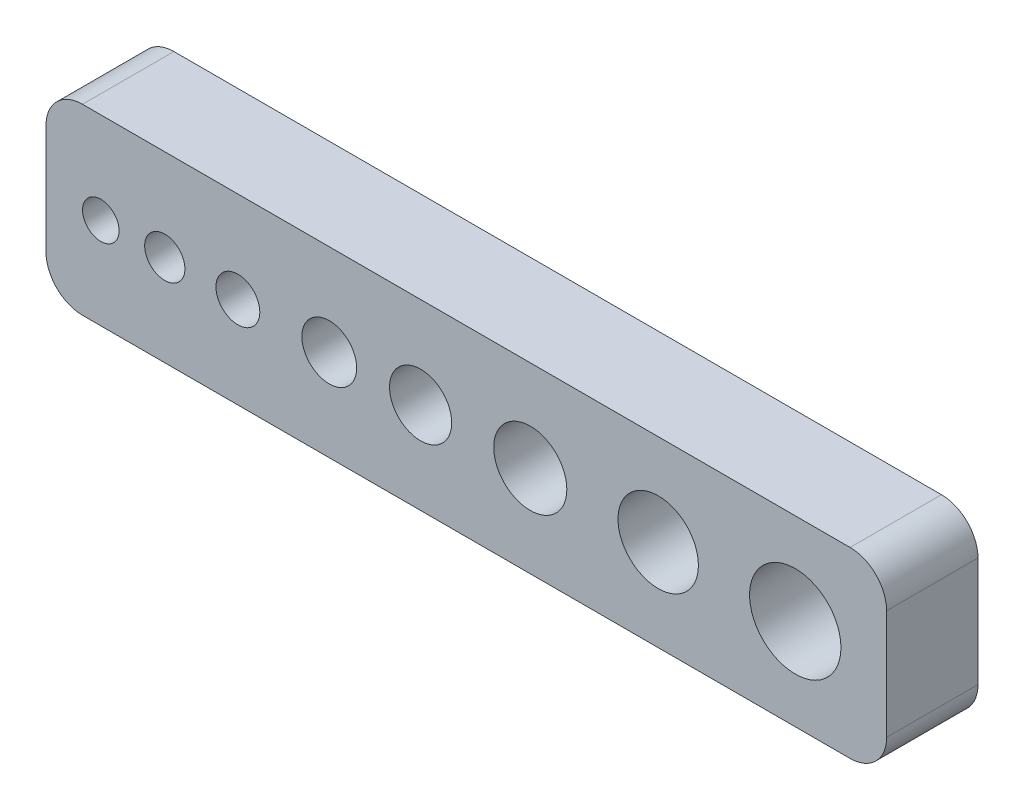
ISO-10303-21;
HEADER;
FILE_DESCRIPTION(('STEP AP214'),'2;1');
FILE_NAME('part.step','',(''),(''),'','','');
FILE_SCHEMA(('AUTOMOTIVE_DESIGN { 1 0 10303 214 1 1 1 1 }'));
ENDSEC;
DATA;
#1=APPLICATION_CONTEXT('core data for automotive mechanical design processes');
#2=APPLICATION_PROTOCOL_DEFINITION('international standard','automotive_design',2000,#1);
#3=PRODUCT_CONTEXT('',#1,'mechanical');
#4=PRODUCT('Part','Part','',(#3));
#5=PRODUCT_RELATED_PRODUCT_CATEGORY('part','',(#4));
#6=PRODUCT_DEFINITION_FORMATION('','',#4);
#7=PRODUCT_DEFINITION_CONTEXT('part definition',#1,'design');
#8=PRODUCT_DEFINITION('design','',#6,#7);
#9=PRODUCT_DEFINITION_SHAPE('','',#8);
#10=(LENGTH_UNIT() NAMED_UNIT(*) SI_UNIT(.MILLI.,.METRE.));
#11=(NAMED_UNIT(*) PLANE_ANGLE_UNIT() SI_UNIT($,.RADIAN.));
#12=(NAMED_UNIT(*) SI_UNIT($,.STERADIAN.) SOLID_ANGLE_UNIT());
#13=UNCERTAINTY_MEASURE_WITH_UNIT(LENGTH_MEASURE(1.E-05),#10,'distance_accuracy_value','');
#14=(GEOMETRIC_REPRESENTATION_CONTEXT(3) GLOBAL_UNCERTAINTY_ASSIGNED_CONTEXT((#13)) GLOBAL_UNIT_ASSIGNED_CONTEXT((#10,
#11,#12)) REPRESENTATION_CONTEXT('',''));
#15=CARTESIAN_POINT('',(0.,0.,0.));
#16=DIRECTION('',(0.,0.,1.));
#17=DIRECTION('',(1.,0.,0.));
#18=AXIS2_PLACEMENT_3D('',#15,#16,#17);
#19=CARTESIAN_POINT('',(-28.5,3.,5.));
#20=DIRECTION('',(0.,0.,1.));
#21=DIRECTION('',(1.,0.,0.));
#22=AXIS2_PLACEMENT_3D('',#19,#20,#21);
#23=PLANE('',#22);
#24=CARTESIAN_POINT('',(-24.,0.,5.));
#25=DIRECTION('',(0.,0.,1.));
#26=DIRECTION('',(1.,0.,0.));
#27=AXIS2_PLACEMENT_3D('',#24,#25,#26);
#28=CIRCLE('',#27,1.1);
#29=CARTESIAN_POINT('',(-22.9,0.,5.));
#30=VERTEX_POINT('',#29);
#31=EDGE_CURVE('E218',#30,#30,#28,.T.);
#32=ORIENTED_EDGE('',*,*,#31,.F.);
#33=EDGE_LOOP('',(#32));
#34=FACE_BOUND('',#33,.T.);
#35=CARTESIAN_POINT('',(-20.,0.,5.));
#36=DIRECTION('',(0.,0.,1.));
#37=DIRECTION('',(1.,0.,0.));
#38=AXIS2_PLACEMENT_3D('',#35,#36,#37);
#39=CIRCLE('',#38,1.2);
#40=CARTESIAN_POINT('',(-18.8,0.,5.));
#41=VERTEX_POINT('',#40);
#42=EDGE_CURVE('E206',#41,#41,#39,.T.);
#43=ORIENTED_EDGE('',*,*,#42,.F.);
#44=EDGE_LOOP('',(#43));
#45=FACE_BOUND('',#44,.T.);
#46=CARTESIAN_POINT('',(10.5,0.,5.));
#47=DIRECTION('',(0.,0.,1.));
#48=DIRECTION('',(1.,0.,0.));
#49=AXIS2_PLACEMENT_3D('',#46,#47,#48);
#50=CIRCLE('',#49,2.5);
#51=CARTESIAN_POINT('',(13.,0.,5.));
#52=VERTEX_POINT('',#51);
#53=EDGE_CURVE('E194',#52,#52,#50,.T.);
#54=ORIENTED_EDGE('',*,*,#53,.F.);
#55=EDGE_LOOP('',(#54));
#56=FACE_BOUND('',#55,.T.);
#57=CARTESIAN_POINT('',(-4.,0.,5.));
#58=DIRECTION('',(0.,0.,1.));
#59=DIRECTION('',(1.,0.,0.));
#60=AXIS2_PLACEMENT_3D('',#57,#58,#59);
#61=CIRCLE('',#60,2.);
#62=CARTESIAN_POINT('',(-2.,0.,5.));
#63=VERTEX_POINT('',#62);
#64=EDGE_CURVE('E140',#63,#63,#61,.T.);
#65=ORIENTED_EDGE('',*,*,#64,.F.);
#66=EDGE_LOOP('',(#65));
#67=FACE_BOUND('',#66,.T.);
#68=CARTESIAN_POINT('',(-28.5,3.,5.));
#69=DIRECTION('',(0.,0.,1.));
#70=DIRECTION('',(1.,0.,0.));
#71=AXIS2_PLACEMENT_3D('',#68,#69,#70);
#72=CIRCLE('',#71,2.);
#73=CARTESIAN_POINT('',(-28.5,5.,5.));
#74=VERTEX_POINT('',#73);
#75=CARTESIAN_POINT('',(-30.5,2.99999999999999,5.));
#76=VERTEX_POINT('',#75);
#77=EDGE_CURVE('E151',#74,#76,#72,.T.);
#78=ORIENTED_EDGE('',*,*,#77,.T.);
#79=DIRECTION('',(0.,-1.,0.));
#80=VECTOR('',#79,1.);
#81=CARTESIAN_POINT('',(-30.5,-2.99999999999999,5.));
#82=LINE('',#81,#80);
#83=CARTESIAN_POINT('',(-30.5,-3.,5.));
#84=VERTEX_POINT('',#83);
#85=EDGE_CURVE('E99',#76,#84,#82,.T.);
#86=ORIENTED_EDGE('',*,*,#85,.T.);
#87=CARTESIAN_POINT('',(-28.5,-3.,5.));
#88=DIRECTION('',(0.,0.,1.));
#89=DIRECTION('',(-1.,0.,0.));
#90=AXIS2_PLACEMENT_3D('',#87,#88,#89);
#91=CIRCLE('',#90,2.);
#92=CARTESIAN_POINT('',(-28.5,-5.,5.));
#93=VERTEX_POINT('',#92);
#94=EDGE_CURVE('E166',#84,#93,#91,.T.);
#95=ORIENTED_EDGE('',*,*,#94,.T.);
#96=DIRECTION('',(1.,0.,0.));
#97=VECTOR('',#96,1.);
#98=CARTESIAN_POINT('',(-28.5,-5.,5.));
#99=LINE('',#98,#97);
#100=CARTESIAN_POINT('',(13.5,-5.,5.));
#101=VERTEX_POINT('',#100);
#102=EDGE_CURVE('E179',#93,#101,#99,.T.);
#103=ORIENTED_EDGE('',*,*,#102,.T.);
#104=CARTESIAN_POINT('',(13.5,-3.,5.));
#105=DIRECTION('',(0.,0.,1.));
#106=DIRECTION('',(1.,0.,0.));
#107=AXIS2_PLACEMENT_3D('',#104,#105,#106);
#108=CIRCLE('',#107,2.);
#109=CARTESIAN_POINT('',(15.5,-2.99999999999999,5.));
#110=VERTEX_POINT('',#109);
#111=EDGE_CURVE('E118',#101,#110,#108,.T.);
#112=ORIENTED_EDGE('',*,*,#111,.T.);
#113=DIRECTION('',(0.,1.,0.));
#114=VECTOR('',#113,1.);
#115=CARTESIAN_POINT('',(15.5,2.99999999999999,5.));
#116=LINE('',#115,#114);
#117=CARTESIAN_POINT('',(15.5,2.99999999999999,5.));
#118=VERTEX_POINT('',#117);
#119=EDGE_CURVE('E112',#110,#118,#116,.T.);
#120=ORIENTED_EDGE('',*,*,#119,.T.);
#121=CARTESIAN_POINT('',(13.5,3.,5.));
#122=DIRECTION('',(0.,0.,1.));
#123=DIRECTION('',(1.,0.,0.));
#124=AXIS2_PLACEMENT_3D('',#121,#122,#123);
#125=CIRCLE('',#124,2.);
#126=CARTESIAN_POINT('',(13.5,5.,5.));
#127=VERTEX_POINT('',#126);
#128=EDGE_CURVE('E116',#118,#127,#125,.T.);
#129=ORIENTED_EDGE('',*,*,#128,.T.);
#130=DIRECTION('',(-1.,0.,0.));
#131=VECTOR('',#130,1.);
#132=CARTESIAN_POINT('',(-28.5,5.,5.));
#133=LINE('',#132,#131);
#134=EDGE_CURVE('E56',#127,#74,#133,.T.);
#135=ORIENTED_EDGE('',*,*,#134,.T.);
#136=EDGE_LOOP('',(#78,#86,#95,#103,#112,#120,#129,#135));
#137=FACE_BOUND('',#136,.T.);
#138=CARTESIAN_POINT('',(3.,0.,5.));
#139=DIRECTION('',(0.,0.,1.));
#140=DIRECTION('',(1.,0.,0.));
#141=AXIS2_PLACEMENT_3D('',#138,#139,#140);
#142=CIRCLE('',#141,2.2);
#143=CARTESIAN_POINT('',(5.2,0.,5.));
#144=VERTEX_POINT('',#143);
#145=EDGE_CURVE('E188',#144,#144,#142,.T.);
#146=ORIENTED_EDGE('',*,*,#145,.F.);
#147=EDGE_LOOP('',(#146));
#148=FACE_BOUND('',#147,.T.);
#149=CARTESIAN_POINT('',(-10.,0.,5.));
#150=DIRECTION('',(0.,0.,1.));
#151=DIRECTION('',(1.,0.,0.));
#152=AXIS2_PLACEMENT_3D('',#149,#150,#151);
#153=CIRCLE('',#152,1.7);
#154=CARTESIAN_POINT('',(-8.3,0.,5.));
#155=VERTEX_POINT('',#154);
#156=EDGE_CURVE('E200',#155,#155,#153,.T.);
#157=ORIENTED_EDGE('',*,*,#156,.F.);
#158=EDGE_LOOP('',(#157));
#159=FACE_BOUND('',#158,.T.);
#160=CARTESIAN_POINT('',(-15.,0.,5.));
#161=DIRECTION('',(0.,0.,1.));
#162=DIRECTION('',(1.,0.,0.));
#163=AXIS2_PLACEMENT_3D('',#160,#161,#162);
#164=CIRCLE('',#163,1.5);
#165=CARTESIAN_POINT('',(-13.5,0.,5.));
#166=VERTEX_POINT('',#165);
#167=EDGE_CURVE('E212',#166,#166,#164,.T.);
#168=ORIENTED_EDGE('',*,*,#167,.F.);
#169=EDGE_LOOP('',(#168));
#170=FACE_BOUND('',#169,.T.);
#171=CARTESIAN_POINT('',(-27.5,0.,5.));
#172=DIRECTION('',(0.,0.,1.));
#173=DIRECTION('',(1.,0.,0.));
#174=AXIS2_PLACEMENT_3D('',#171,#172,#173);
#175=CIRCLE('',#174,1.);
#176=CARTESIAN_POINT('',(-26.5,0.,5.));
#177=VERTEX_POINT('',#176);
#178=EDGE_CURVE('E224',#177,#177,#175,.T.);
#179=ORIENTED_EDGE('',*,*,#178,.F.);
#180=EDGE_LOOP('',(#179));
#181=FACE_BOUND('',#180,.T.);
#182=ADVANCED_FACE('F39',(#34,#45,#56,#67,#137,#148,#159,#170,#181),#23,.T.);
#183=CARTESIAN_POINT('',(-28.5,3.,0.));
#184=DIRECTION('',(0.,0.,1.));
#185=DIRECTION('',(1.,0.,0.));
#186=AXIS2_PLACEMENT_3D('',#183,#184,#185);
#187=PLANE('',#186);
#188=CARTESIAN_POINT('',(-28.5,3.,0.));
#189=DIRECTION('',(0.,0.,1.));
#190=DIRECTION('',(1.,0.,0.));
#191=AXIS2_PLACEMENT_3D('',#188,#189,#190);
#192=CIRCLE('',#191,2.);
#193=CARTESIAN_POINT('',(-28.5,5.,0.));
#194=VERTEX_POINT('',#193);
#195=CARTESIAN_POINT('',(-30.5,2.99999999999999,0.));
#196=VERTEX_POINT('',#195);
#197=EDGE_CURVE('E136',#194,#196,#192,.T.);
#198=ORIENTED_EDGE('',*,*,#197,.F.);
#199=DIRECTION('',(-1.,0.,0.));
#200=VECTOR('',#199,1.);
#201=CARTESIAN_POINT('',(-28.5,5.,0.));
#202=LINE('',#201,#200);
#203=CARTESIAN_POINT('',(13.5,5.,0.));
#204=VERTEX_POINT('',#203);
#205=EDGE_CURVE('E91',#204,#194,#202,.T.);
#206=ORIENTED_EDGE('',*,*,#205,.F.);
#207=CARTESIAN_POINT('',(13.5,3.,0.));
#208=DIRECTION('',(0.,0.,1.));
#209=DIRECTION('',(1.,0.,0.));
#210=AXIS2_PLACEMENT_3D('',#207,#208,#209);
#211=CIRCLE('',#210,2.);
#212=CARTESIAN_POINT('',(15.5,2.99999999999999,0.));
#213=VERTEX_POINT('',#212);
#214=EDGE_CURVE('E85',#213,#204,#211,.T.);
#215=ORIENTED_EDGE('',*,*,#214,.F.);
#216=DIRECTION('',(0.,1.,0.));
#217=VECTOR('',#216,1.);
#218=CARTESIAN_POINT('',(15.5,2.99999999999999,0.));
#219=LINE('',#218,#217);
#220=CARTESIAN_POINT('',(15.5,-2.99999999999999,0.));
#221=VERTEX_POINT('',#220);
#222=EDGE_CURVE('E126',#221,#213,#219,.T.);
#223=ORIENTED_EDGE('',*,*,#222,.F.);
#224=CARTESIAN_POINT('',(13.5,-3.,0.));
#225=DIRECTION('',(0.,0.,1.));
#226=DIRECTION('',(1.,0.,0.));
#227=AXIS2_PLACEMENT_3D('',#224,#225,#226);
#228=CIRCLE('',#227,2.);
#229=CARTESIAN_POINT('',(13.5,-5.,0.));
#230=VERTEX_POINT('',#229);
#231=EDGE_CURVE('E146',#230,#221,#228,.T.);
#232=ORIENTED_EDGE('',*,*,#231,.F.);
#233=DIRECTION('',(1.,0.,0.));
#234=VECTOR('',#233,1.);
#235=CARTESIAN_POINT('',(-28.5,-5.,0.));
#236=LINE('',#235,#234);
#237=CARTESIAN_POINT('',(-28.5,-5.,0.));
#238=VERTEX_POINT('',#237);
#239=EDGE_CURVE('E144',#238,#230,#236,.T.);
#240=ORIENTED_EDGE('',*,*,#239,.F.);
#241=CARTESIAN_POINT('',(-28.5,-3.,0.));
#242=DIRECTION('',(0.,0.,1.));
#243=DIRECTION('',(-1.,0.,0.));
#244=AXIS2_PLACEMENT_3D('',#241,#242,#243);
#245=CIRCLE('',#244,2.);
#246=CARTESIAN_POINT('',(-30.5,-3.,0.));
#247=VERTEX_POINT('',#246);
#248=EDGE_CURVE('E142',#247,#238,#245,.T.);
#249=ORIENTED_EDGE('',*,*,#248,.F.);
#250=DIRECTION('',(0.,-1.,0.));
#251=VECTOR('',#250,1.);
#252=CARTESIAN_POINT('',(-30.5,-2.99999999999999,0.));
#253=LINE('',#252,#251);
#254=EDGE_CURVE('E139',#196,#247,#253,.T.);
#255=ORIENTED_EDGE('',*,*,#254,.F.);
#256=EDGE_LOOP('',(#198,#206,#215,#223,#232,#240,#249,#255));
#257=FACE_BOUND('',#256,.T.);
#258=CARTESIAN_POINT('',(-4.,0.,0.));
#259=DIRECTION('',(0.,0.,1.));
#260=DIRECTION('',(1.,0.,0.));
#261=AXIS2_PLACEMENT_3D('',#258,#259,#260);
#262=CIRCLE('',#261,2.);
#263=CARTESIAN_POINT('',(-2.,0.,0.));
#264=VERTEX_POINT('',#263);
#265=EDGE_CURVE('E185',#264,#264,#262,.T.);
#266=ORIENTED_EDGE('',*,*,#265,.T.);
#267=EDGE_LOOP('',(#266));
#268=FACE_BOUND('',#267,.T.);
#269=CARTESIAN_POINT('',(3.,0.,0.));
#270=DIRECTION('',(0.,0.,1.));
#271=DIRECTION('',(1.,0.,0.));
#272=AXIS2_PLACEMENT_3D('',#269,#270,#271);
#273=CIRCLE('',#272,2.2);
#274=CARTESIAN_POINT('',(5.2,0.,0.));
#275=VERTEX_POINT('',#274);
#276=EDGE_CURVE('E191',#275,#275,#273,.T.);
#277=ORIENTED_EDGE('',*,*,#276,.T.);
#278=EDGE_LOOP('',(#277));
#279=FACE_BOUND('',#278,.T.);
#280=CARTESIAN_POINT('',(10.5,0.,0.));
#281=DIRECTION('',(0.,0.,1.));
#282=DIRECTION('',(1.,0.,0.));
#283=AXIS2_PLACEMENT_3D('',#280,#281,#282);
#284=CIRCLE('',#283,2.5);
#285=CARTESIAN_POINT('',(13.,0.,0.));
#286=VERTEX_POINT('',#285);
#287=EDGE_CURVE('E197',#286,#286,#284,.T.);
#288=ORIENTED_EDGE('',*,*,#287,.T.);
#289=EDGE_LOOP('',(#288));
#290=FACE_BOUND('',#289,.T.);
#291=CARTESIAN_POINT('',(-10.,0.,0.));
#292=DIRECTION('',(0.,0.,1.));
#293=DIRECTION('',(1.,0.,0.));
#294=AXIS2_PLACEMENT_3D('',#291,#292,#293);
#295=CIRCLE('',#294,1.7);
#296=CARTESIAN_POINT('',(-8.3,0.,0.));
#297=VERTEX_POINT('',#296);
#298=EDGE_CURVE('E203',#297,#297,#295,.T.);
#299=ORIENTED_EDGE('',*,*,#298,.T.);
#300=EDGE_LOOP('',(#299));
#301=FACE_BOUND('',#300,.T.);
#302=CARTESIAN_POINT('',(-20.,0.,0.));
#303=DIRECTION('',(0.,0.,1.));
#304=DIRECTION('',(1.,0.,0.));
#305=AXIS2_PLACEMENT_3D('',#302,#303,#304);
#306=CIRCLE('',#305,1.2);
#307=CARTESIAN_POINT('',(-18.8,0.,0.));
#308=VERTEX_POINT('',#307);
#309=EDGE_CURVE('E209',#308,#308,#306,.T.);
#310=ORIENTED_EDGE('',*,*,#309,.T.);
#311=EDGE_LOOP('',(#310));
#312=FACE_BOUND('',#311,.T.);
#313=CARTESIAN_POINT('',(-15.,0.,0.));
#314=DIRECTION('',(0.,0.,1.));
#315=DIRECTION('',(1.,0.,0.));
#316=AXIS2_PLACEMENT_3D('',#313,#314,#315);
#317=CIRCLE('',#316,1.5);
#318=CARTESIAN_POINT('',(-13.5,0.,0.));
#319=VERTEX_POINT('',#318);
#320=EDGE_CURVE('E215',#319,#319,#317,.T.);
#321=ORIENTED_EDGE('',*,*,#320,.T.);
#322=EDGE_LOOP('',(#321));
#323=FACE_BOUND('',#322,.T.);
#324=CARTESIAN_POINT('',(-24.,0.,0.));
#325=DIRECTION('',(0.,0.,1.));
#326=DIRECTION('',(1.,0.,0.));
#327=AXIS2_PLACEMENT_3D('',#324,#325,#326);
#328=CIRCLE('',#327,1.1);
#329=CARTESIAN_POINT('',(-22.9,0.,0.));
#330=VERTEX_POINT('',#329);
#331=EDGE_CURVE('E221',#330,#330,#328,.T.);
#332=ORIENTED_EDGE('',*,*,#331,.T.);
#333=EDGE_LOOP('',(#332));
#334=FACE_BOUND('',#333,.T.);
#335=CARTESIAN_POINT('',(-27.5,0.,0.));
#336=DIRECTION('',(0.,0.,1.));
#337=DIRECTION('',(1.,0.,0.));
#338=AXIS2_PLACEMENT_3D('',#335,#336,#337);
#339=CIRCLE('',#338,1.);
#340=CARTESIAN_POINT('',(-26.5,0.,0.));
#341=VERTEX_POINT('',#340);
#342=EDGE_CURVE('E227',#341,#341,#339,.T.);
#343=ORIENTED_EDGE('',*,*,#342,.T.);
#344=EDGE_LOOP('',(#343));
#345=FACE_BOUND('',#344,.T.);
#346=ADVANCED_FACE('F170',(#257,#268,#279,#290,#301,#312,#323,#334,#345),#187,.F.);
#347=CARTESIAN_POINT('',(-28.5,3.,5.));
#348=DIRECTION('',(0.,0.,-1.));
#349=DIRECTION('',(-1.,0.,0.));
#350=AXIS2_PLACEMENT_3D('',#347,#348,#349);
#351=CYLINDRICAL_SURFACE('',#350,2.);
#352=ORIENTED_EDGE('',*,*,#197,.T.);
#353=DIRECTION('',(0.,0.,-1.));
#354=VECTOR('',#353,1.);
#355=CARTESIAN_POINT('',(-30.5,2.99999999999999,5.));
#356=LINE('',#355,#354);
#357=EDGE_CURVE('E11',#76,#196,#356,.T.);
#358=ORIENTED_EDGE('',*,*,#357,.F.);
#359=ORIENTED_EDGE('',*,*,#77,.F.);
#360=DIRECTION('',(0.,0.,-1.));
#361=VECTOR('',#360,1.);
#362=CARTESIAN_POINT('',(-28.5,5.,5.));
#363=LINE('',#362,#361);
#364=EDGE_CURVE('E132',#74,#194,#363,.T.);
#365=ORIENTED_EDGE('',*,*,#364,.T.);
#366=EDGE_LOOP('',(#352,#358,#359,#365));
#367=FACE_BOUND('',#366,.T.);
#368=ADVANCED_FACE('F41',(#367),#351,.T.);
#369=CARTESIAN_POINT('',(-30.5,-2.99999999999999,5.));
#370=DIRECTION('',(1.,0.,0.));
#371=DIRECTION('',(0.,0.,-1.));
#372=AXIS2_PLACEMENT_3D('',#369,#370,#371);
#373=PLANE('',#372);
#374=ORIENTED_EDGE('',*,*,#254,.T.);
#375=DIRECTION('',(0.,0.,-1.));
#376=VECTOR('',#375,1.);
#377=CARTESIAN_POINT('',(-30.5,-3.,5.));
#378=LINE('',#377,#376);
#379=EDGE_CURVE('E48',#84,#247,#378,.T.);
#380=ORIENTED_EDGE('',*,*,#379,.F.);
#381=ORIENTED_EDGE('',*,*,#85,.F.);
#382=ORIENTED_EDGE('',*,*,#357,.T.);
#383=EDGE_LOOP('',(#374,#380,#381,#382));
#384=FACE_BOUND('',#383,.T.);
#385=ADVANCED_FACE('F261',(#384),#373,.F.);
#386=CARTESIAN_POINT('',(-28.5,-3.,5.));
#387=DIRECTION('',(0.,0.,-1.));
#388=DIRECTION('',(-1.,0.,0.));
#389=AXIS2_PLACEMENT_3D('',#386,#387,#388);
#390=CYLINDRICAL_SURFACE('',#389,2.);
#391=ORIENTED_EDGE('',*,*,#248,.T.);
#392=DIRECTION('',(0.,0.,-1.));
#393=VECTOR('',#392,1.);
#394=CARTESIAN_POINT('',(-28.5,-5.,5.));
#395=LINE('',#394,#393);
#396=EDGE_CURVE('E158',#93,#238,#395,.T.);
#397=ORIENTED_EDGE('',*,*,#396,.F.);
#398=ORIENTED_EDGE('',*,*,#94,.F.);
#399=ORIENTED_EDGE('',*,*,#379,.T.);
#400=EDGE_LOOP('',(#391,#397,#398,#399));
#401=FACE_BOUND('',#400,.T.);
#402=ADVANCED_FACE('F164',(#401),#390,.T.);
#403=CARTESIAN_POINT('',(-28.5,-5.,5.));
#404=DIRECTION('',(0.,1.,0.));
#405=DIRECTION('',(0.,0.,1.));
#406=AXIS2_PLACEMENT_3D('',#403,#404,#405);
#407=PLANE('',#406);
#408=ORIENTED_EDGE('',*,*,#239,.T.);
#409=DIRECTION('',(0.,0.,-1.));
#410=VECTOR('',#409,1.);
#411=CARTESIAN_POINT('',(13.5,-5.,5.));
#412=LINE('',#411,#410);
#413=EDGE_CURVE('E155',#101,#230,#412,.T.);
#414=ORIENTED_EDGE('',*,*,#413,.F.);
#415=ORIENTED_EDGE('',*,*,#102,.F.);
#416=ORIENTED_EDGE('',*,*,#396,.T.);
#417=EDGE_LOOP('',(#408,#414,#415,#416));
#418=FACE_BOUND('',#417,.T.);
#419=ADVANCED_FACE('F175',(#418),#407,.F.);
#420=CARTESIAN_POINT('',(13.5,-3.,5.));
#421=DIRECTION('',(0.,0.,-1.));
#422=DIRECTION('',(-1.,0.,0.));
#423=AXIS2_PLACEMENT_3D('',#420,#421,#422);
#424=CYLINDRICAL_SURFACE('',#423,2.);
#425=ORIENTED_EDGE('',*,*,#231,.T.);
#426=DIRECTION('',(0.,0.,-1.));
#427=VECTOR('',#426,1.);
#428=CARTESIAN_POINT('',(15.5,-2.99999999999999,5.));
#429=LINE('',#428,#427);
#430=EDGE_CURVE('E127',#110,#221,#429,.T.);
#431=ORIENTED_EDGE('',*,*,#430,.F.);
#432=ORIENTED_EDGE('',*,*,#111,.F.);
#433=ORIENTED_EDGE('',*,*,#413,.T.);
#434=EDGE_LOOP('',(#425,#431,#432,#433));
#435=FACE_BOUND('',#434,.T.);
#436=ADVANCED_FACE('F178',(#435),#424,.T.);
#437=CARTESIAN_POINT('',(15.5,2.99999999999999,5.));
#438=DIRECTION('',(-1.,0.,0.));
#439=DIRECTION('',(0.,0.,1.));
#440=AXIS2_PLACEMENT_3D('',#437,#438,#439);
#441=PLANE('',#440);
#442=ORIENTED_EDGE('',*,*,#222,.T.);
#443=DIRECTION('',(0.,0.,-1.));
#444=VECTOR('',#443,1.);
#445=CARTESIAN_POINT('',(15.5,2.99999999999999,5.));
#446=LINE('',#445,#444);
#447=EDGE_CURVE('E123',#118,#213,#446,.T.);
#448=ORIENTED_EDGE('',*,*,#447,.F.);
#449=ORIENTED_EDGE('',*,*,#119,.F.);
#450=ORIENTED_EDGE('',*,*,#430,.T.);
#451=EDGE_LOOP('',(#442,#448,#449,#450));
#452=FACE_BOUND('',#451,.T.);
#453=ADVANCED_FACE('F124',(#452),#441,.F.);
#454=CARTESIAN_POINT('',(13.5,3.,5.));
#455=DIRECTION('',(0.,0.,-1.));
#456=DIRECTION('',(-1.,0.,0.));
#457=AXIS2_PLACEMENT_3D('',#454,#455,#456);
#458=CYLINDRICAL_SURFACE('',#457,2.);
#459=ORIENTED_EDGE('',*,*,#214,.T.);
#460=DIRECTION('',(0.,0.,-1.));
#461=VECTOR('',#460,1.);
#462=CARTESIAN_POINT('',(13.5,5.,5.));
#463=LINE('',#462,#461);
#464=EDGE_CURVE('E128',#127,#204,#463,.T.);
#465=ORIENTED_EDGE('',*,*,#464,.F.);
#466=ORIENTED_EDGE('',*,*,#128,.F.);
#467=ORIENTED_EDGE('',*,*,#447,.T.);
#468=EDGE_LOOP('',(#459,#465,#466,#467));
#469=FACE_BOUND('',#468,.T.);
#470=ADVANCED_FACE('F130',(#469),#458,.T.);
#471=CARTESIAN_POINT('',(-28.5,5.,5.));
#472=DIRECTION('',(0.,-1.,0.));
#473=DIRECTION('',(0.,0.,-1.));
#474=AXIS2_PLACEMENT_3D('',#471,#472,#473);
#475=PLANE('',#474);
#476=ORIENTED_EDGE('',*,*,#205,.T.);
#477=ORIENTED_EDGE('',*,*,#364,.F.);
#478=ORIENTED_EDGE('',*,*,#134,.F.);
#479=ORIENTED_EDGE('',*,*,#464,.T.);
#480=EDGE_LOOP('',(#476,#477,#478,#479));
#481=FACE_BOUND('',#480,.T.);
#482=ADVANCED_FACE('F249',(#481),#475,.F.);
#483=CARTESIAN_POINT('',(-4.,0.,5.));
#484=DIRECTION('',(0.,0.,-1.));
#485=DIRECTION('',(-1.,0.,0.));
#486=AXIS2_PLACEMENT_3D('',#483,#484,#485);
#487=CYLINDRICAL_SURFACE('',#486,2.);
#488=ORIENTED_EDGE('',*,*,#64,.T.);
#489=EDGE_LOOP('',(#488));
#490=FACE_BOUND('',#489,.T.);
#491=ORIENTED_EDGE('',*,*,#265,.F.);
#492=EDGE_LOOP('',(#491));
#493=FACE_BOUND('',#492,.T.);
#494=ADVANCED_FACE('F246',(#490,#493),#487,.F.);
#495=CARTESIAN_POINT('',(3.,0.,5.));
#496=DIRECTION('',(0.,0.,-1.));
#497=DIRECTION('',(-1.,0.,0.));
#498=AXIS2_PLACEMENT_3D('',#495,#496,#497);
#499=CYLINDRICAL_SURFACE('',#498,2.2);
#500=ORIENTED_EDGE('',*,*,#145,.T.);
#501=EDGE_LOOP('',(#500));
#502=FACE_BOUND('',#501,.T.);
#503=ORIENTED_EDGE('',*,*,#276,.F.);
#504=EDGE_LOOP('',(#503));
#505=FACE_BOUND('',#504,.T.);
#506=ADVANCED_FACE('F324',(#502,#505),#499,.F.);
#507=CARTESIAN_POINT('',(10.5,0.,5.));
#508=DIRECTION('',(0.,0.,-1.));
#509=DIRECTION('',(-1.,0.,0.));
#510=AXIS2_PLACEMENT_3D('',#507,#508,#509);
#511=CYLINDRICAL_SURFACE('',#510,2.5);
#512=ORIENTED_EDGE('',*,*,#53,.T.);
#513=EDGE_LOOP('',(#512));
#514=FACE_BOUND('',#513,.T.);
#515=ORIENTED_EDGE('',*,*,#287,.F.);
#516=EDGE_LOOP('',(#515));
#517=FACE_BOUND('',#516,.T.);
#518=ADVANCED_FACE('F332',(#514,#517),#511,.F.);
#519=CARTESIAN_POINT('',(-10.,0.,5.));
#520=DIRECTION('',(0.,0.,-1.));
#521=DIRECTION('',(-1.,0.,0.));
#522=AXIS2_PLACEMENT_3D('',#519,#520,#521);
#523=CYLINDRICAL_SURFACE('',#522,1.7);
#524=ORIENTED_EDGE('',*,*,#156,.T.);
#525=EDGE_LOOP('',(#524));
#526=FACE_BOUND('',#525,.T.);
#527=ORIENTED_EDGE('',*,*,#298,.F.);
#528=EDGE_LOOP('',(#527));
#529=FACE_BOUND('',#528,.T.);
#530=ADVANCED_FACE('F340',(#526,#529),#523,.F.);
#531=CARTESIAN_POINT('',(-20.,0.,5.));
#532=DIRECTION('',(0.,0.,-1.));
#533=DIRECTION('',(-1.,0.,0.));
#534=AXIS2_PLACEMENT_3D('',#531,#532,#533);
#535=CYLINDRICAL_SURFACE('',#534,1.2);
#536=ORIENTED_EDGE('',*,*,#42,.T.);
#537=EDGE_LOOP('',(#536));
#538=FACE_BOUND('',#537,.T.);
#539=ORIENTED_EDGE('',*,*,#309,.F.);
#540=EDGE_LOOP('',(#539));
#541=FACE_BOUND('',#540,.T.);
#542=ADVANCED_FACE('F349',(#538,#541),#535,.F.);
#543=CARTESIAN_POINT('',(-15.,0.,5.));
#544=DIRECTION('',(0.,0.,-1.));
#545=DIRECTION('',(-1.,0.,0.));
#546=AXIS2_PLACEMENT_3D('',#543,#544,#545);
#547=CYLINDRICAL_SURFACE('',#546,1.5);
#548=ORIENTED_EDGE('',*,*,#167,.T.);
#549=EDGE_LOOP('',(#548));
#550=FACE_BOUND('',#549,.T.);
#551=ORIENTED_EDGE('',*,*,#320,.F.);
#552=EDGE_LOOP('',(#551));
#553=FACE_BOUND('',#552,.T.);
#554=ADVANCED_FACE('F358',(#550,#553),#547,.F.);
#555=CARTESIAN_POINT('',(-24.,0.,5.));
#556=DIRECTION('',(0.,0.,-1.));
#557=DIRECTION('',(-1.,0.,0.));
#558=AXIS2_PLACEMENT_3D('',#555,#556,#557);
#559=CYLINDRICAL_SURFACE('',#558,1.1);
#560=ORIENTED_EDGE('',*,*,#31,.T.);
#561=EDGE_LOOP('',(#560));
#562=FACE_BOUND('',#561,.T.);
#563=ORIENTED_EDGE('',*,*,#331,.F.);
#564=EDGE_LOOP('',(#563));
#565=FACE_BOUND('',#564,.T.);
#566=ADVANCED_FACE('F367',(#562,#565),#559,.F.);
#567=CARTESIAN_POINT('',(-27.5,0.,5.));
#568=DIRECTION('',(0.,0.,-1.));
#569=DIRECTION('',(-1.,0.,0.));
#570=AXIS2_PLACEMENT_3D('',#567,#568,#569);
#571=CYLINDRICAL_SURFACE('',#570,1.);
#572=ORIENTED_EDGE('',*,*,#178,.T.);
#573=EDGE_LOOP('',(#572));
#574=FACE_BOUND('',#573,.T.);
#575=ORIENTED_EDGE('',*,*,#342,.F.);
#576=EDGE_LOOP('',(#575));
#577=FACE_BOUND('',#576,.T.);
#578=ADVANCED_FACE('F233',(#574,#577),#571,.F.);
#579=CLOSED_SHELL('',(#182,#346,#368,#385,#402,#419,#436,#453,#470,#482,#494,#506,#518,#530,
#542,#554,#566,#578));
#580=MANIFOLD_SOLID_BREP('B2',#579);
#581=ADVANCED_BREP_SHAPE_REPRESENTATION('',(#18,#580),#14);
#582=SHAPE_DEFINITION_REPRESENTATION(#9,#581);
ENDSEC;
END-ISO-10303-21;
